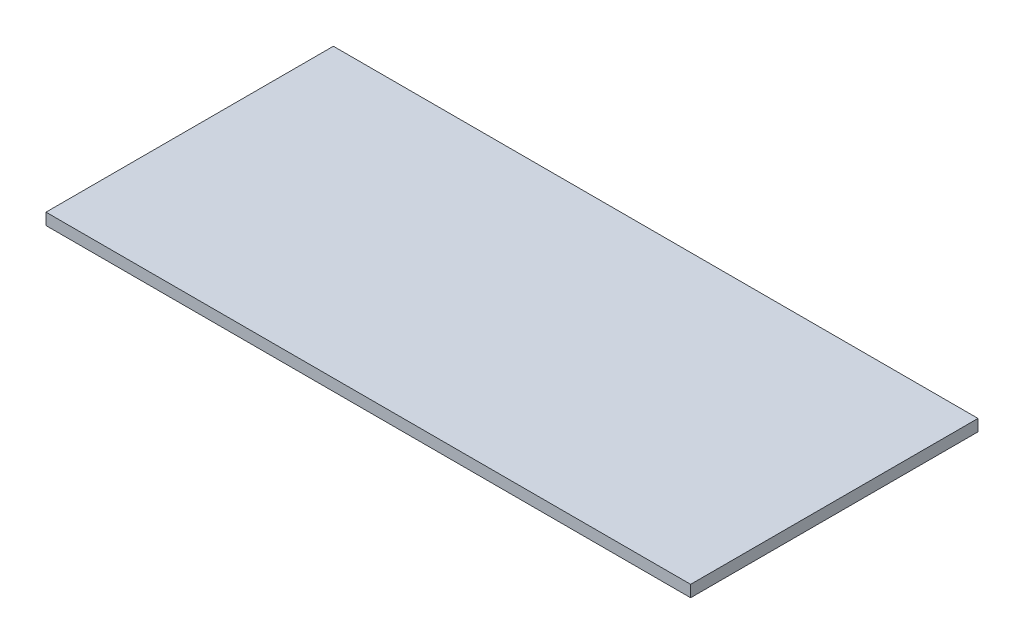
ISO-10303-21;
HEADER;
FILE_DESCRIPTION(('STEP AP214'),'2;1');
FILE_NAME('part.step','',(''),(''),'','','');
FILE_SCHEMA(('AUTOMOTIVE_DESIGN { 1 0 10303 214 1 1 1 1 }'));
ENDSEC;
DATA;
#1=APPLICATION_CONTEXT('core data for automotive mechanical design processes');
#2=APPLICATION_PROTOCOL_DEFINITION('international standard','automotive_design',2000,#1);
#3=PRODUCT_CONTEXT('',#1,'mechanical');
#4=PRODUCT('Part','Part','',(#3));
#5=PRODUCT_RELATED_PRODUCT_CATEGORY('part','',(#4));
#6=PRODUCT_DEFINITION_FORMATION('','',#4);
#7=PRODUCT_DEFINITION_CONTEXT('part definition',#1,'design');
#8=PRODUCT_DEFINITION('design','',#6,#7);
#9=PRODUCT_DEFINITION_SHAPE('','',#8);
#10=(LENGTH_UNIT() NAMED_UNIT(*) SI_UNIT(.MILLI.,.METRE.));
#11=(NAMED_UNIT(*) PLANE_ANGLE_UNIT() SI_UNIT($,.RADIAN.));
#12=(NAMED_UNIT(*) SI_UNIT($,.STERADIAN.) SOLID_ANGLE_UNIT());
#13=UNCERTAINTY_MEASURE_WITH_UNIT(LENGTH_MEASURE(1.E-05),#10,'distance_accuracy_value','');
#14=(GEOMETRIC_REPRESENTATION_CONTEXT(3) GLOBAL_UNCERTAINTY_ASSIGNED_CONTEXT((#13)) GLOBAL_UNIT_ASSIGNED_CONTEXT((#10,
#11,#12)) REPRESENTATION_CONTEXT('',''));
#15=CARTESIAN_POINT('',(0.,0.,0.));
#16=DIRECTION('',(0.,0.,1.));
#17=DIRECTION('',(1.,0.,0.));
#18=AXIS2_PLACEMENT_3D('',#15,#16,#17);
#19=CARTESIAN_POINT('',(-19.05,933.45,-933.45));
#20=DIRECTION('',(1.,0.,0.));
#21=DIRECTION('',(0.,0.,-1.));
#22=AXIS2_PLACEMENT_3D('',#19,#20,#21);
#23=PLANE('',#22);
#24=DIRECTION('',(0.,0.,1.));
#25=VECTOR('',#24,1.);
#26=CARTESIAN_POINT('',(-19.05,914.4,-933.45));
#27=LINE('',#26,#25);
#28=CARTESIAN_POINT('',(-19.05,914.4,-933.45));
#29=VERTEX_POINT('',#28);
#30=CARTESIAN_POINT('',(-19.05,914.4,-463.55));
#31=VERTEX_POINT('',#30);
#32=EDGE_CURVE('E96',#29,#31,#27,.T.);
#33=ORIENTED_EDGE('',*,*,#32,.T.);
#34=DIRECTION('',(0.,-1.,0.));
#35=VECTOR('',#34,1.);
#36=CARTESIAN_POINT('',(-19.05,933.45,-463.55));
#37=LINE('',#36,#35);
#38=CARTESIAN_POINT('',(-19.05,933.45,-463.55));
#39=VERTEX_POINT('',#38);
#40=EDGE_CURVE('E11',#39,#31,#37,.T.);
#41=ORIENTED_EDGE('',*,*,#40,.F.);
#42=DIRECTION('',(0.,0.,1.));
#43=VECTOR('',#42,1.);
#44=CARTESIAN_POINT('',(-19.05,933.45,-933.45));
#45=LINE('',#44,#43);
#46=CARTESIAN_POINT('',(-19.05,933.45,-933.45));
#47=VERTEX_POINT('',#46);
#48=EDGE_CURVE('E84',#47,#39,#45,.T.);
#49=ORIENTED_EDGE('',*,*,#48,.F.);
#50=DIRECTION('',(0.,-1.,0.));
#51=VECTOR('',#50,1.);
#52=CARTESIAN_POINT('',(-19.05,933.45,-933.45));
#53=LINE('',#52,#51);
#54=EDGE_CURVE('E92',#47,#29,#53,.T.);
#55=ORIENTED_EDGE('',*,*,#54,.T.);
#56=EDGE_LOOP('',(#33,#41,#49,#55));
#57=FACE_BOUND('',#56,.T.);
#58=ADVANCED_FACE('F33',(#57),#23,.F.);
#59=CARTESIAN_POINT('',(-19.05,933.45,-463.55));
#60=DIRECTION('',(0.,0.,-1.));
#61=DIRECTION('',(-1.,0.,0.));
#62=AXIS2_PLACEMENT_3D('',#59,#60,#61);
#63=PLANE('',#62);
#64=DIRECTION('',(1.,0.,0.));
#65=VECTOR('',#64,1.);
#66=CARTESIAN_POINT('',(-19.05,914.4,-463.55));
#67=LINE('',#66,#65);
#68=CARTESIAN_POINT('',(1035.05,914.4,-463.55));
#69=VERTEX_POINT('',#68);
#70=EDGE_CURVE('E88',#31,#69,#67,.T.);
#71=ORIENTED_EDGE('',*,*,#70,.T.);
#72=DIRECTION('',(0.,-1.,0.));
#73=VECTOR('',#72,1.);
#74=CARTESIAN_POINT('',(1035.05,933.45,-463.55));
#75=LINE('',#74,#73);
#76=CARTESIAN_POINT('',(1035.05,933.45,-463.55));
#77=VERTEX_POINT('',#76);
#78=EDGE_CURVE('E41',#77,#69,#75,.T.);
#79=ORIENTED_EDGE('',*,*,#78,.F.);
#80=DIRECTION('',(1.,0.,0.));
#81=VECTOR('',#80,1.);
#82=CARTESIAN_POINT('',(-19.05,933.45,-463.55));
#83=LINE('',#82,#81);
#84=EDGE_CURVE('E79',#39,#77,#83,.T.);
#85=ORIENTED_EDGE('',*,*,#84,.F.);
#86=ORIENTED_EDGE('',*,*,#40,.T.);
#87=EDGE_LOOP('',(#71,#79,#85,#86));
#88=FACE_BOUND('',#87,.T.);
#89=ADVANCED_FACE('F87',(#88),#63,.F.);
#90=CARTESIAN_POINT('',(1035.05,933.45,-933.45));
#91=DIRECTION('',(-1.,0.,0.));
#92=DIRECTION('',(0.,0.,1.));
#93=AXIS2_PLACEMENT_3D('',#90,#91,#92);
#94=PLANE('',#93);
#95=DIRECTION('',(0.,0.,-1.));
#96=VECTOR('',#95,1.);
#97=CARTESIAN_POINT('',(1035.05,914.4,-933.45));
#98=LINE('',#97,#96);
#99=CARTESIAN_POINT('',(1035.05,914.4,-933.45));
#100=VERTEX_POINT('',#99);
#101=EDGE_CURVE('E66',#69,#100,#98,.T.);
#102=ORIENTED_EDGE('',*,*,#101,.T.);
#103=DIRECTION('',(0.,-1.,0.));
#104=VECTOR('',#103,1.);
#105=CARTESIAN_POINT('',(1035.05,933.45,-933.45));
#106=LINE('',#105,#104);
#107=CARTESIAN_POINT('',(1035.05,933.45,-933.45));
#108=VERTEX_POINT('',#107);
#109=EDGE_CURVE('E89',#108,#100,#106,.T.);
#110=ORIENTED_EDGE('',*,*,#109,.F.);
#111=DIRECTION('',(0.,0.,-1.));
#112=VECTOR('',#111,1.);
#113=CARTESIAN_POINT('',(1035.05,933.45,-933.45));
#114=LINE('',#113,#112);
#115=EDGE_CURVE('E82',#77,#108,#114,.T.);
#116=ORIENTED_EDGE('',*,*,#115,.F.);
#117=ORIENTED_EDGE('',*,*,#78,.T.);
#118=EDGE_LOOP('',(#102,#110,#116,#117));
#119=FACE_BOUND('',#118,.T.);
#120=ADVANCED_FACE('F90',(#119),#94,.F.);
#121=CARTESIAN_POINT('',(-19.05,933.45,-933.45));
#122=DIRECTION('',(0.,0.,1.));
#123=DIRECTION('',(1.,0.,0.));
#124=AXIS2_PLACEMENT_3D('',#121,#122,#123);
#125=PLANE('',#124);
#126=DIRECTION('',(-1.,0.,0.));
#127=VECTOR('',#126,1.);
#128=CARTESIAN_POINT('',(-19.05,914.4,-933.45));
#129=LINE('',#128,#127);
#130=EDGE_CURVE('E72',#100,#29,#129,.T.);
#131=ORIENTED_EDGE('',*,*,#130,.T.);
#132=ORIENTED_EDGE('',*,*,#54,.F.);
#133=DIRECTION('',(-1.,0.,0.));
#134=VECTOR('',#133,1.);
#135=CARTESIAN_POINT('',(-19.05,933.45,-933.45));
#136=LINE('',#135,#134);
#137=EDGE_CURVE('E49',#108,#47,#136,.T.);
#138=ORIENTED_EDGE('',*,*,#137,.F.);
#139=ORIENTED_EDGE('',*,*,#109,.T.);
#140=EDGE_LOOP('',(#131,#132,#138,#139));
#141=FACE_BOUND('',#140,.T.);
#142=ADVANCED_FACE('F103',(#141),#125,.F.);
#143=CARTESIAN_POINT('',(0.,933.45,0.));
#144=DIRECTION('',(0.,1.,0.));
#145=DIRECTION('',(0.,0.,1.));
#146=AXIS2_PLACEMENT_3D('',#143,#144,#145);
#147=PLANE('',#146);
#148=ORIENTED_EDGE('',*,*,#48,.T.);
#149=ORIENTED_EDGE('',*,*,#84,.T.);
#150=ORIENTED_EDGE('',*,*,#115,.T.);
#151=ORIENTED_EDGE('',*,*,#137,.T.);
#152=EDGE_LOOP('',(#148,#149,#150,#151));
#153=FACE_BOUND('',#152,.T.);
#154=ADVANCED_FACE('F80',(#153),#147,.T.);
#155=CARTESIAN_POINT('',(0.,914.4,0.));
#156=DIRECTION('',(0.,1.,0.));
#157=DIRECTION('',(0.,0.,1.));
#158=AXIS2_PLACEMENT_3D('',#155,#156,#157);
#159=PLANE('',#158);
#160=ORIENTED_EDGE('',*,*,#32,.F.);
#161=ORIENTED_EDGE('',*,*,#130,.F.);
#162=ORIENTED_EDGE('',*,*,#101,.F.);
#163=ORIENTED_EDGE('',*,*,#70,.F.);
#164=EDGE_LOOP('',(#160,#161,#162,#163));
#165=FACE_BOUND('',#164,.T.);
#166=ADVANCED_FACE('F106',(#165),#159,.F.);
#167=CLOSED_SHELL('',(#58,#89,#120,#142,#154,#166));
#168=MANIFOLD_SOLID_BREP('B2',#167);
#169=ADVANCED_BREP_SHAPE_REPRESENTATION('',(#18,#168),#14);
#170=SHAPE_DEFINITION_REPRESENTATION(#9,#169);
ENDSEC;
END-ISO-10303-21;
